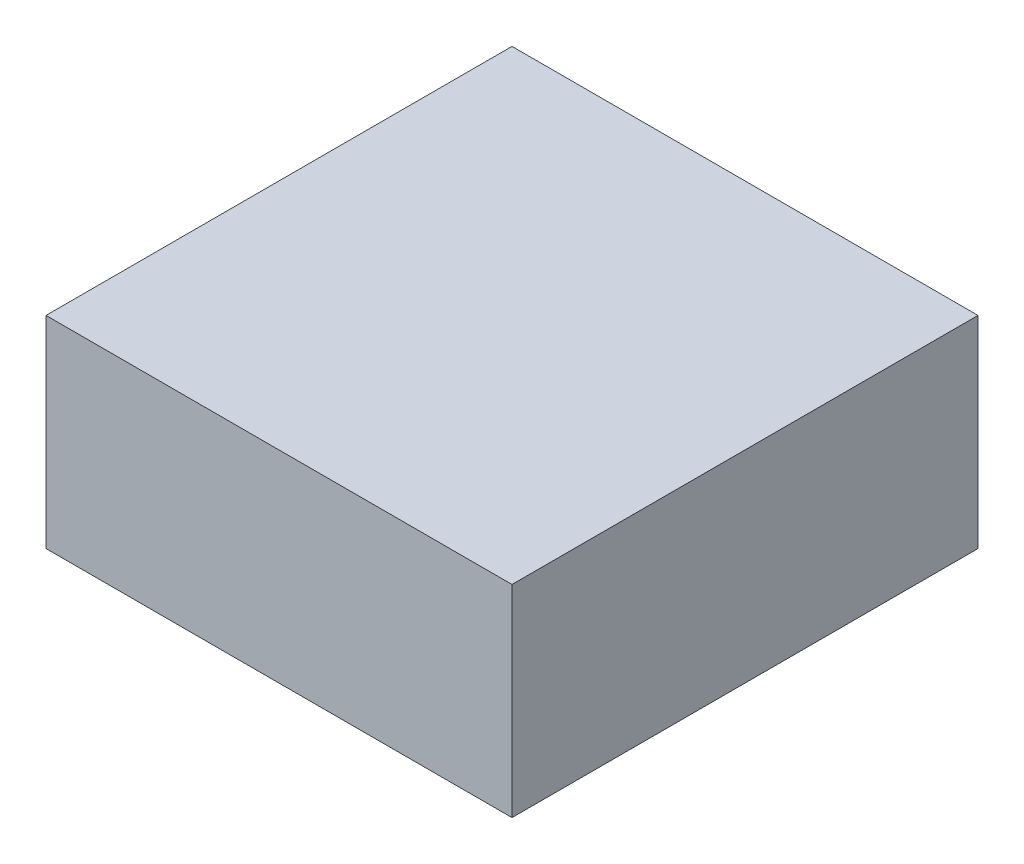
ISO-10303-21;
HEADER;
FILE_DESCRIPTION(('STEP AP214'),'2;1');
FILE_NAME('part.step','',(''),(''),'','','');
FILE_SCHEMA(('AUTOMOTIVE_DESIGN { 1 0 10303 214 1 1 1 1 }'));
ENDSEC;
DATA;
#1=APPLICATION_CONTEXT('core data for automotive mechanical design processes');
#2=APPLICATION_PROTOCOL_DEFINITION('international standard','automotive_design',2000,#1);
#3=PRODUCT_CONTEXT('',#1,'mechanical');
#4=PRODUCT('Part','Part','',(#3));
#5=PRODUCT_RELATED_PRODUCT_CATEGORY('part','',(#4));
#6=PRODUCT_DEFINITION_FORMATION('','',#4);
#7=PRODUCT_DEFINITION_CONTEXT('part definition',#1,'design');
#8=PRODUCT_DEFINITION('design','',#6,#7);
#9=PRODUCT_DEFINITION_SHAPE('','',#8);
#10=(LENGTH_UNIT() NAMED_UNIT(*) SI_UNIT(.MILLI.,.METRE.));
#11=(NAMED_UNIT(*) PLANE_ANGLE_UNIT() SI_UNIT($,.RADIAN.));
#12=(NAMED_UNIT(*) SI_UNIT($,.STERADIAN.) SOLID_ANGLE_UNIT());
#13=UNCERTAINTY_MEASURE_WITH_UNIT(LENGTH_MEASURE(1.E-05),#10,'distance_accuracy_value','');
#14=(GEOMETRIC_REPRESENTATION_CONTEXT(3) GLOBAL_UNCERTAINTY_ASSIGNED_CONTEXT((#13)) GLOBAL_UNIT_ASSIGNED_CONTEXT((#10,
#11,#12)) REPRESENTATION_CONTEXT('',''));
#15=CARTESIAN_POINT('',(0.,0.,0.));
#16=DIRECTION('',(0.,0.,1.));
#17=DIRECTION('',(1.,0.,0.));
#18=AXIS2_PLACEMENT_3D('',#15,#16,#17);
#19=CARTESIAN_POINT('',(-9.525,8.255,9.525));
#20=DIRECTION('',(1.,0.,0.));
#21=DIRECTION('',(0.,0.,-1.));
#22=AXIS2_PLACEMENT_3D('',#19,#20,#21);
#23=PLANE('',#22);
#24=DIRECTION('',(0.,0.,1.));
#25=VECTOR('',#24,1.);
#26=CARTESIAN_POINT('',(-9.525,0.,9.525));
#27=LINE('',#26,#25);
#28=CARTESIAN_POINT('',(-9.525,0.,-9.525));
#29=VERTEX_POINT('',#28);
#30=CARTESIAN_POINT('',(-9.525,0.,9.525));
#31=VERTEX_POINT('',#30);
#32=EDGE_CURVE('E95',#29,#31,#27,.T.);
#33=ORIENTED_EDGE('',*,*,#32,.T.);
#34=DIRECTION('',(0.,-1.,0.));
#35=VECTOR('',#34,1.);
#36=CARTESIAN_POINT('',(-9.525,8.255,9.525));
#37=LINE('',#36,#35);
#38=CARTESIAN_POINT('',(-9.525,8.255,9.525));
#39=VERTEX_POINT('',#38);
#40=EDGE_CURVE('E11',#39,#31,#37,.T.);
#41=ORIENTED_EDGE('',*,*,#40,.F.);
#42=DIRECTION('',(0.,0.,1.));
#43=VECTOR('',#42,1.);
#44=CARTESIAN_POINT('',(-9.525,8.255,9.525));
#45=LINE('',#44,#43);
#46=CARTESIAN_POINT('',(-9.525,8.255,-9.525));
#47=VERTEX_POINT('',#46);
#48=EDGE_CURVE('E83',#47,#39,#45,.T.);
#49=ORIENTED_EDGE('',*,*,#48,.F.);
#50=DIRECTION('',(0.,-1.,0.));
#51=VECTOR('',#50,1.);
#52=CARTESIAN_POINT('',(-9.525,8.255,-9.525));
#53=LINE('',#52,#51);
#54=EDGE_CURVE('E91',#47,#29,#53,.T.);
#55=ORIENTED_EDGE('',*,*,#54,.T.);
#56=EDGE_LOOP('',(#33,#41,#49,#55));
#57=FACE_BOUND('',#56,.T.);
#58=ADVANCED_FACE('F32',(#57),#23,.F.);
#59=CARTESIAN_POINT('',(9.525,8.255,9.525));
#60=DIRECTION('',(0.,0.,-1.));
#61=DIRECTION('',(-1.,0.,0.));
#62=AXIS2_PLACEMENT_3D('',#59,#60,#61);
#63=PLANE('',#62);
#64=DIRECTION('',(1.,0.,0.));
#65=VECTOR('',#64,1.);
#66=CARTESIAN_POINT('',(9.525,0.,9.525));
#67=LINE('',#66,#65);
#68=CARTESIAN_POINT('',(9.525,0.,9.525));
#69=VERTEX_POINT('',#68);
#70=EDGE_CURVE('E87',#31,#69,#67,.T.);
#71=ORIENTED_EDGE('',*,*,#70,.T.);
#72=DIRECTION('',(0.,-1.,0.));
#73=VECTOR('',#72,1.);
#74=CARTESIAN_POINT('',(9.525,8.255,9.525));
#75=LINE('',#74,#73);
#76=CARTESIAN_POINT('',(9.525,8.255,9.525));
#77=VERTEX_POINT('',#76);
#78=EDGE_CURVE('E40',#77,#69,#75,.T.);
#79=ORIENTED_EDGE('',*,*,#78,.F.);
#80=DIRECTION('',(1.,0.,0.));
#81=VECTOR('',#80,1.);
#82=CARTESIAN_POINT('',(9.525,8.255,9.525));
#83=LINE('',#82,#81);
#84=EDGE_CURVE('E78',#39,#77,#83,.T.);
#85=ORIENTED_EDGE('',*,*,#84,.F.);
#86=ORIENTED_EDGE('',*,*,#40,.T.);
#87=EDGE_LOOP('',(#71,#79,#85,#86));
#88=FACE_BOUND('',#87,.T.);
#89=ADVANCED_FACE('F86',(#88),#63,.F.);
#90=CARTESIAN_POINT('',(9.525,8.255,9.525));
#91=DIRECTION('',(-1.,0.,0.));
#92=DIRECTION('',(0.,0.,1.));
#93=AXIS2_PLACEMENT_3D('',#90,#91,#92);
#94=PLANE('',#93);
#95=DIRECTION('',(0.,0.,-1.));
#96=VECTOR('',#95,1.);
#97=CARTESIAN_POINT('',(9.525,0.,9.525));
#98=LINE('',#97,#96);
#99=CARTESIAN_POINT('',(9.525,0.,-9.525));
#100=VERTEX_POINT('',#99);
#101=EDGE_CURVE('E65',#69,#100,#98,.T.);
#102=ORIENTED_EDGE('',*,*,#101,.T.);
#103=DIRECTION('',(0.,-1.,0.));
#104=VECTOR('',#103,1.);
#105=CARTESIAN_POINT('',(9.525,8.255,-9.525));
#106=LINE('',#105,#104);
#107=CARTESIAN_POINT('',(9.525,8.255,-9.525));
#108=VERTEX_POINT('',#107);
#109=EDGE_CURVE('E88',#108,#100,#106,.T.);
#110=ORIENTED_EDGE('',*,*,#109,.F.);
#111=DIRECTION('',(0.,0.,-1.));
#112=VECTOR('',#111,1.);
#113=CARTESIAN_POINT('',(9.525,8.255,9.525));
#114=LINE('',#113,#112);
#115=EDGE_CURVE('E81',#77,#108,#114,.T.);
#116=ORIENTED_EDGE('',*,*,#115,.F.);
#117=ORIENTED_EDGE('',*,*,#78,.T.);
#118=EDGE_LOOP('',(#102,#110,#116,#117));
#119=FACE_BOUND('',#118,.T.);
#120=ADVANCED_FACE('F89',(#119),#94,.F.);
#121=CARTESIAN_POINT('',(9.525,8.255,-9.525));
#122=DIRECTION('',(0.,0.,1.));
#123=DIRECTION('',(1.,0.,0.));
#124=AXIS2_PLACEMENT_3D('',#121,#122,#123);
#125=PLANE('',#124);
#126=DIRECTION('',(-1.,0.,0.));
#127=VECTOR('',#126,1.);
#128=CARTESIAN_POINT('',(9.525,0.,-9.525));
#129=LINE('',#128,#127);
#130=EDGE_CURVE('E71',#100,#29,#129,.T.);
#131=ORIENTED_EDGE('',*,*,#130,.T.);
#132=ORIENTED_EDGE('',*,*,#54,.F.);
#133=DIRECTION('',(-1.,0.,0.));
#134=VECTOR('',#133,1.);
#135=CARTESIAN_POINT('',(9.525,8.255,-9.525));
#136=LINE('',#135,#134);
#137=EDGE_CURVE('E48',#108,#47,#136,.T.);
#138=ORIENTED_EDGE('',*,*,#137,.F.);
#139=ORIENTED_EDGE('',*,*,#109,.T.);
#140=EDGE_LOOP('',(#131,#132,#138,#139));
#141=FACE_BOUND('',#140,.T.);
#142=ADVANCED_FACE('F102',(#141),#125,.F.);
#143=CARTESIAN_POINT('',(-9.52499999999999,8.255,-9.525));
#144=DIRECTION('',(0.,1.,0.));
#145=DIRECTION('',(0.,0.,1.));
#146=AXIS2_PLACEMENT_3D('',#143,#144,#145);
#147=PLANE('',#146);
#148=ORIENTED_EDGE('',*,*,#48,.T.);
#149=ORIENTED_EDGE('',*,*,#84,.T.);
#150=ORIENTED_EDGE('',*,*,#115,.T.);
#151=ORIENTED_EDGE('',*,*,#137,.T.);
#152=EDGE_LOOP('',(#148,#149,#150,#151));
#153=FACE_BOUND('',#152,.T.);
#154=ADVANCED_FACE('F79',(#153),#147,.T.);
#155=CARTESIAN_POINT('',(-9.52499999999999,0.,-9.525));
#156=DIRECTION('',(0.,1.,0.));
#157=DIRECTION('',(0.,0.,1.));
#158=AXIS2_PLACEMENT_3D('',#155,#156,#157);
#159=PLANE('',#158);
#160=ORIENTED_EDGE('',*,*,#32,.F.);
#161=ORIENTED_EDGE('',*,*,#130,.F.);
#162=ORIENTED_EDGE('',*,*,#101,.F.);
#163=ORIENTED_EDGE('',*,*,#70,.F.);
#164=EDGE_LOOP('',(#160,#161,#162,#163));
#165=FACE_BOUND('',#164,.T.);
#166=ADVANCED_FACE('F105',(#165),#159,.F.);
#167=CLOSED_SHELL('',(#58,#89,#120,#142,#154,#166));
#168=MANIFOLD_SOLID_BREP('B2',#167);
#169=ADVANCED_BREP_SHAPE_REPRESENTATION('',(#18,#168),#14);
#170=SHAPE_DEFINITION_REPRESENTATION(#9,#169);
ENDSEC;
END-ISO-10303-21;
